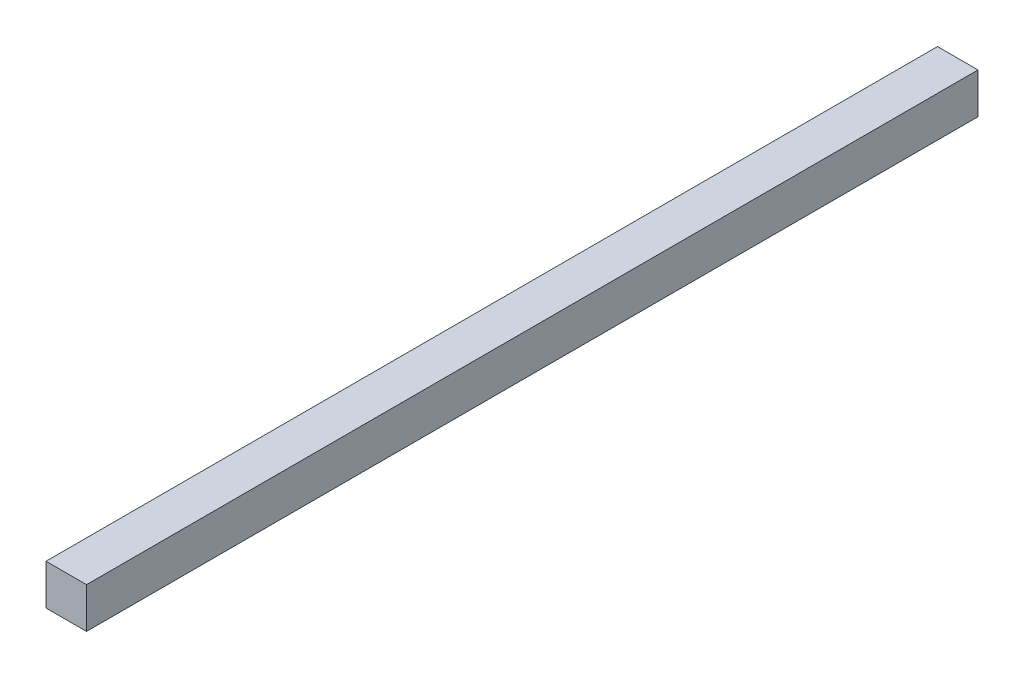
ISO-10303-21;
HEADER;
FILE_DESCRIPTION(('STEP AP214'),'2;1');
FILE_NAME('part.step','',(''),(''),'','','');
FILE_SCHEMA(('AUTOMOTIVE_DESIGN { 1 0 10303 214 1 1 1 1 }'));
ENDSEC;
DATA;
#1=APPLICATION_CONTEXT('core data for automotive mechanical design processes');
#2=APPLICATION_PROTOCOL_DEFINITION('international standard','automotive_design',2000,#1);
#3=PRODUCT_CONTEXT('',#1,'mechanical');
#4=PRODUCT('Part','Part','',(#3));
#5=PRODUCT_RELATED_PRODUCT_CATEGORY('part','',(#4));
#6=PRODUCT_DEFINITION_FORMATION('','',#4);
#7=PRODUCT_DEFINITION_CONTEXT('part definition',#1,'design');
#8=PRODUCT_DEFINITION('design','',#6,#7);
#9=PRODUCT_DEFINITION_SHAPE('','',#8);
#10=(LENGTH_UNIT() NAMED_UNIT(*) SI_UNIT(.MILLI.,.METRE.));
#11=(NAMED_UNIT(*) PLANE_ANGLE_UNIT() SI_UNIT($,.RADIAN.));
#12=(NAMED_UNIT(*) SI_UNIT($,.STERADIAN.) SOLID_ANGLE_UNIT());
#13=UNCERTAINTY_MEASURE_WITH_UNIT(LENGTH_MEASURE(1.E-05),#10,'distance_accuracy_value','');
#14=(GEOMETRIC_REPRESENTATION_CONTEXT(3) GLOBAL_UNCERTAINTY_ASSIGNED_CONTEXT((#13)) GLOBAL_UNIT_ASSIGNED_CONTEXT((#10,
#11,#12)) REPRESENTATION_CONTEXT('',''));
#15=CARTESIAN_POINT('',(0.,0.,0.));
#16=DIRECTION('',(0.,0.,1.));
#17=DIRECTION('',(1.,0.,0.));
#18=AXIS2_PLACEMENT_3D('',#15,#16,#17);
#19=CARTESIAN_POINT('',(20.,1300.,-500.));
#20=DIRECTION('',(-1.,0.,0.));
#21=DIRECTION('',(0.,0.,1.));
#22=AXIS2_PLACEMENT_3D('',#19,#20,#21);
#23=PLANE('',#22);
#24=DIRECTION('',(0.,-1.,0.));
#25=VECTOR('',#24,1.);
#26=CARTESIAN_POINT('',(20.,1300.,-60.));
#27=LINE('',#26,#25);
#28=CARTESIAN_POINT('',(20.,1320.,-60.));
#29=VERTEX_POINT('',#28);
#30=CARTESIAN_POINT('',(20.,1300.,-60.));
#31=VERTEX_POINT('',#30);
#32=EDGE_CURVE('E103',#29,#31,#27,.T.);
#33=ORIENTED_EDGE('',*,*,#32,.F.);
#34=DIRECTION('',(0.,0.,1.));
#35=VECTOR('',#34,1.);
#36=CARTESIAN_POINT('',(20.,1320.,-500.));
#37=LINE('',#36,#35);
#38=CARTESIAN_POINT('',(20.,1320.,-500.));
#39=VERTEX_POINT('',#38);
#40=EDGE_CURVE('E11',#39,#29,#37,.T.);
#41=ORIENTED_EDGE('',*,*,#40,.F.);
#42=DIRECTION('',(0.,-1.,0.));
#43=VECTOR('',#42,1.);
#44=CARTESIAN_POINT('',(20.,1300.,-500.));
#45=LINE('',#44,#43);
#46=CARTESIAN_POINT('',(20.,1300.,-500.));
#47=VERTEX_POINT('',#46);
#48=EDGE_CURVE('E97',#39,#47,#45,.T.);
#49=ORIENTED_EDGE('',*,*,#48,.T.);
#50=DIRECTION('',(0.,0.,1.));
#51=VECTOR('',#50,1.);
#52=CARTESIAN_POINT('',(20.,1300.,-500.));
#53=LINE('',#52,#51);
#54=EDGE_CURVE('E42',#47,#31,#53,.T.);
#55=ORIENTED_EDGE('',*,*,#54,.T.);
#56=EDGE_LOOP('',(#33,#41,#49,#55));
#57=FACE_BOUND('',#56,.T.);
#58=ADVANCED_FACE('F39',(#57),#23,.T.);
#59=CARTESIAN_POINT('',(20.,1320.,-500.));
#60=DIRECTION('',(0.,1.,0.));
#61=DIRECTION('',(0.,0.,1.));
#62=AXIS2_PLACEMENT_3D('',#59,#60,#61);
#63=PLANE('',#62);
#64=DIRECTION('',(-1.,0.,0.));
#65=VECTOR('',#64,1.);
#66=CARTESIAN_POINT('',(20.,1320.,-60.));
#67=LINE('',#66,#65);
#68=CARTESIAN_POINT('',(40.,1320.,-60.));
#69=VERTEX_POINT('',#68);
#70=EDGE_CURVE('E99',#69,#29,#67,.T.);
#71=ORIENTED_EDGE('',*,*,#70,.F.);
#72=DIRECTION('',(0.,0.,1.));
#73=VECTOR('',#72,1.);
#74=CARTESIAN_POINT('',(40.,1320.,-500.));
#75=LINE('',#74,#73);
#76=CARTESIAN_POINT('',(40.,1320.,-500.));
#77=VERTEX_POINT('',#76);
#78=EDGE_CURVE('E48',#77,#69,#75,.T.);
#79=ORIENTED_EDGE('',*,*,#78,.F.);
#80=DIRECTION('',(-1.,0.,0.));
#81=VECTOR('',#80,1.);
#82=CARTESIAN_POINT('',(20.,1320.,-500.));
#83=LINE('',#82,#81);
#84=EDGE_CURVE('E94',#77,#39,#83,.T.);
#85=ORIENTED_EDGE('',*,*,#84,.T.);
#86=ORIENTED_EDGE('',*,*,#40,.T.);
#87=EDGE_LOOP('',(#71,#79,#85,#86));
#88=FACE_BOUND('',#87,.T.);
#89=ADVANCED_FACE('F113',(#88),#63,.T.);
#90=CARTESIAN_POINT('',(40.,1300.,-500.));
#91=DIRECTION('',(1.,0.,0.));
#92=DIRECTION('',(0.,0.,-1.));
#93=AXIS2_PLACEMENT_3D('',#90,#91,#92);
#94=PLANE('',#93);
#95=DIRECTION('',(0.,1.,0.));
#96=VECTOR('',#95,1.);
#97=CARTESIAN_POINT('',(40.,1300.,-60.));
#98=LINE('',#97,#96);
#99=CARTESIAN_POINT('',(40.,1300.,-60.));
#100=VERTEX_POINT('',#99);
#101=EDGE_CURVE('E89',#100,#69,#98,.T.);
#102=ORIENTED_EDGE('',*,*,#101,.F.);
#103=DIRECTION('',(0.,0.,1.));
#104=VECTOR('',#103,1.);
#105=CARTESIAN_POINT('',(40.,1300.,-500.));
#106=LINE('',#105,#104);
#107=CARTESIAN_POINT('',(40.,1300.,-500.));
#108=VERTEX_POINT('',#107);
#109=EDGE_CURVE('E84',#108,#100,#106,.T.);
#110=ORIENTED_EDGE('',*,*,#109,.F.);
#111=DIRECTION('',(0.,1.,0.));
#112=VECTOR('',#111,1.);
#113=CARTESIAN_POINT('',(40.,1300.,-500.));
#114=LINE('',#113,#112);
#115=EDGE_CURVE('E87',#108,#77,#114,.T.);
#116=ORIENTED_EDGE('',*,*,#115,.T.);
#117=ORIENTED_EDGE('',*,*,#78,.T.);
#118=EDGE_LOOP('',(#102,#110,#116,#117));
#119=FACE_BOUND('',#118,.T.);
#120=ADVANCED_FACE('F86',(#119),#94,.T.);
#121=CARTESIAN_POINT('',(20.,1300.,-500.));
#122=DIRECTION('',(0.,-1.,0.));
#123=DIRECTION('',(0.,0.,-1.));
#124=AXIS2_PLACEMENT_3D('',#121,#122,#123);
#125=PLANE('',#124);
#126=DIRECTION('',(1.,0.,0.));
#127=VECTOR('',#126,1.);
#128=CARTESIAN_POINT('',(20.,1300.,-60.));
#129=LINE('',#128,#127);
#130=EDGE_CURVE('E106',#31,#100,#129,.T.);
#131=ORIENTED_EDGE('',*,*,#130,.F.);
#132=ORIENTED_EDGE('',*,*,#54,.F.);
#133=DIRECTION('',(1.,0.,0.));
#134=VECTOR('',#133,1.);
#135=CARTESIAN_POINT('',(20.,1300.,-500.));
#136=LINE('',#135,#134);
#137=EDGE_CURVE('E93',#47,#108,#136,.T.);
#138=ORIENTED_EDGE('',*,*,#137,.T.);
#139=ORIENTED_EDGE('',*,*,#109,.T.);
#140=EDGE_LOOP('',(#131,#132,#138,#139));
#141=FACE_BOUND('',#140,.T.);
#142=ADVANCED_FACE('F96',(#141),#125,.T.);
#143=CARTESIAN_POINT('',(0.,0.,-500.));
#144=DIRECTION('',(0.,0.,-1.));
#145=DIRECTION('',(-1.,0.,0.));
#146=AXIS2_PLACEMENT_3D('',#143,#144,#145);
#147=PLANE('',#146);
#148=ORIENTED_EDGE('',*,*,#48,.F.);
#149=ORIENTED_EDGE('',*,*,#84,.F.);
#150=ORIENTED_EDGE('',*,*,#115,.F.);
#151=ORIENTED_EDGE('',*,*,#137,.F.);
#152=EDGE_LOOP('',(#148,#149,#150,#151));
#153=FACE_BOUND('',#152,.T.);
#154=ADVANCED_FACE('F92',(#153),#147,.T.);
#155=CARTESIAN_POINT('',(0.,0.,-60.));
#156=DIRECTION('',(0.,0.,-1.));
#157=DIRECTION('',(-1.,0.,0.));
#158=AXIS2_PLACEMENT_3D('',#155,#156,#157);
#159=PLANE('',#158);
#160=ORIENTED_EDGE('',*,*,#32,.T.);
#161=ORIENTED_EDGE('',*,*,#130,.T.);
#162=ORIENTED_EDGE('',*,*,#101,.T.);
#163=ORIENTED_EDGE('',*,*,#70,.T.);
#164=EDGE_LOOP('',(#160,#161,#162,#163));
#165=FACE_BOUND('',#164,.T.);
#166=ADVANCED_FACE('F112',(#165),#159,.F.);
#167=CLOSED_SHELL('',(#58,#89,#120,#142,#154,#166));
#168=MANIFOLD_SOLID_BREP('B2',#167);
#169=ADVANCED_BREP_SHAPE_REPRESENTATION('',(#18,#168),#14);
#170=SHAPE_DEFINITION_REPRESENTATION(#9,#169);
ENDSEC;
END-ISO-10303-21;
